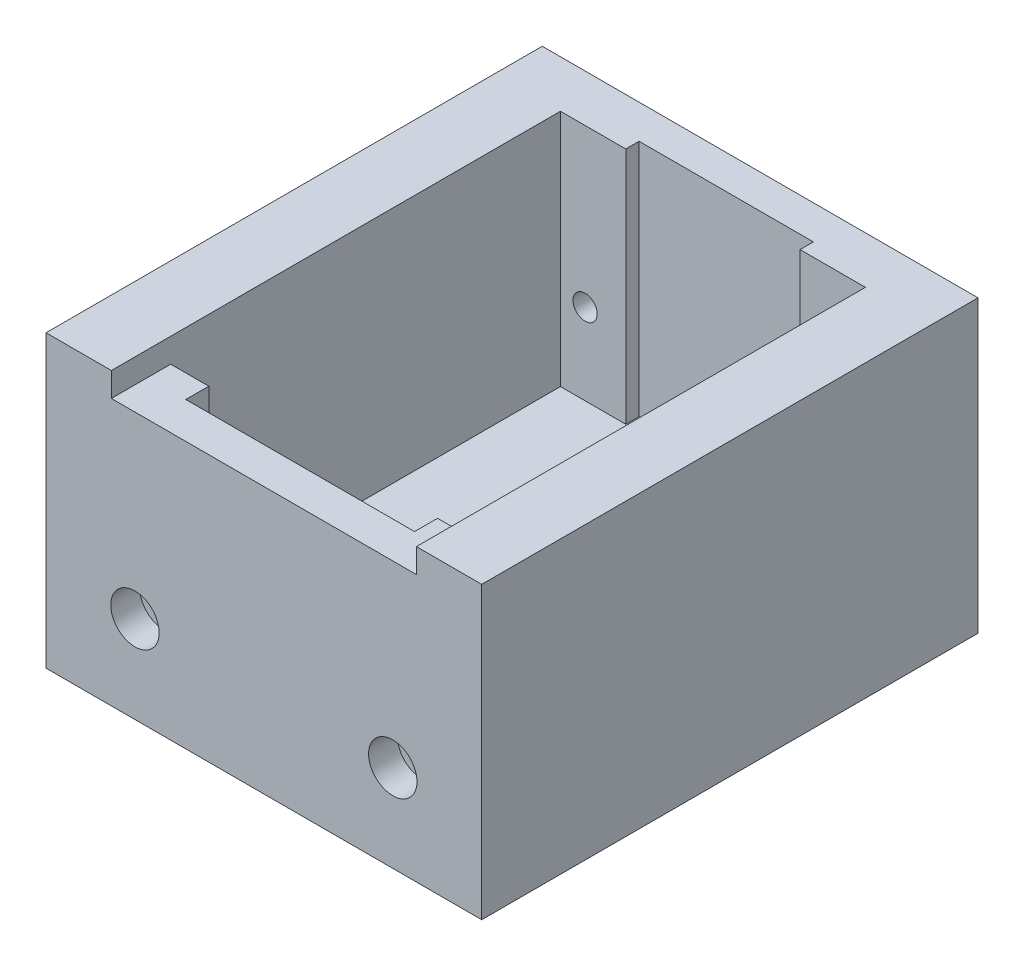
ISO-10303-21;
HEADER;
FILE_DESCRIPTION(('STEP AP214'),'2;1');
FILE_NAME('part.step','',(''),(''),'','','');
FILE_SCHEMA(('AUTOMOTIVE_DESIGN { 1 0 10303 214 1 1 1 1 }'));
ENDSEC;
DATA;
#1=APPLICATION_CONTEXT('core data for automotive mechanical design processes');
#2=APPLICATION_PROTOCOL_DEFINITION('international standard','automotive_design',2000,#1);
#3=PRODUCT_CONTEXT('',#1,'mechanical');
#4=PRODUCT('Part','Part','',(#3));
#5=PRODUCT_RELATED_PRODUCT_CATEGORY('part','',(#4));
#6=PRODUCT_DEFINITION_FORMATION('','',#4);
#7=PRODUCT_DEFINITION_CONTEXT('part definition',#1,'design');
#8=PRODUCT_DEFINITION('design','',#6,#7);
#9=PRODUCT_DEFINITION_SHAPE('','',#8);
#10=(LENGTH_UNIT() NAMED_UNIT(*) SI_UNIT(.MILLI.,.METRE.));
#11=(NAMED_UNIT(*) PLANE_ANGLE_UNIT() SI_UNIT($,.RADIAN.));
#12=(NAMED_UNIT(*) SI_UNIT($,.STERADIAN.) SOLID_ANGLE_UNIT());
#13=UNCERTAINTY_MEASURE_WITH_UNIT(LENGTH_MEASURE(1.E-05),#10,'distance_accuracy_value','');
#14=(GEOMETRIC_REPRESENTATION_CONTEXT(3) GLOBAL_UNCERTAINTY_ASSIGNED_CONTEXT((#13)) GLOBAL_UNIT_ASSIGNED_CONTEXT((#10,
#11,#12)) REPRESENTATION_CONTEXT('',''));
#15=CARTESIAN_POINT('',(0.,0.,0.));
#16=DIRECTION('',(0.,0.,1.));
#17=DIRECTION('',(1.,0.,0.));
#18=AXIS2_PLACEMENT_3D('',#15,#16,#17);
#19=CARTESIAN_POINT('',(0.,24.,0.));
#20=DIRECTION('',(0.,-1.,0.));
#21=DIRECTION('',(0.,0.,-1.));
#22=AXIS2_PLACEMENT_3D('',#19,#20,#21);
#23=PLANE('',#22);
#24=DIRECTION('',(0.,0.,-1.));
#25=VECTOR('',#24,1.);
#26=CARTESIAN_POINT('',(12.6,24.,16.1));
#27=LINE('',#26,#25);
#28=CARTESIAN_POINT('',(12.6,24.,21.));
#29=VERTEX_POINT('',#28);
#30=CARTESIAN_POINT('',(12.6,24.,-16.1));
#31=VERTEX_POINT('',#30);
#32=EDGE_CURVE('E236',#29,#31,#27,.T.);
#33=ORIENTED_EDGE('',*,*,#32,.F.);
#34=DIRECTION('',(-1.,0.,0.));
#35=VECTOR('',#34,1.);
#36=CARTESIAN_POINT('',(0.,24.,21.));
#37=LINE('',#36,#35);
#38=CARTESIAN_POINT('',(18.,24.,21.));
#39=VERTEX_POINT('',#38);
#40=EDGE_CURVE('E293',#39,#29,#37,.T.);
#41=ORIENTED_EDGE('',*,*,#40,.F.);
#42=DIRECTION('',(0.,0.,-1.));
#43=VECTOR('',#42,1.);
#44=CARTESIAN_POINT('',(18.,24.,25.));
#45=LINE('',#44,#43);
#46=CARTESIAN_POINT('',(18.,24.,-20.));
#47=VERTEX_POINT('',#46);
#48=EDGE_CURVE('E327',#39,#47,#45,.T.);
#49=ORIENTED_EDGE('',*,*,#48,.T.);
#50=DIRECTION('',(1.,0.,0.));
#51=VECTOR('',#50,1.);
#52=CARTESIAN_POINT('',(0.,24.,-20.));
#53=LINE('',#52,#51);
#54=CARTESIAN_POINT('',(-18.,24.,-20.));
#55=VERTEX_POINT('',#54);
#56=EDGE_CURVE('E287',#55,#47,#53,.T.);
#57=ORIENTED_EDGE('',*,*,#56,.F.);
#58=DIRECTION('',(0.,0.,1.));
#59=VECTOR('',#58,1.);
#60=CARTESIAN_POINT('',(-18.,24.,25.));
#61=LINE('',#60,#59);
#62=CARTESIAN_POINT('',(-18.,24.,21.));
#63=VERTEX_POINT('',#62);
#64=EDGE_CURVE('E330',#55,#63,#61,.T.);
#65=ORIENTED_EDGE('',*,*,#64,.T.);
#66=CARTESIAN_POINT('',(-12.6,24.,21.));
#67=VERTEX_POINT('',#66);
#68=EDGE_CURVE('E172',#67,#63,#37,.T.);
#69=ORIENTED_EDGE('',*,*,#68,.F.);
#70=DIRECTION('',(0.,0.,1.));
#71=VECTOR('',#70,1.);
#72=CARTESIAN_POINT('',(-12.6,24.,-16.1));
#73=LINE('',#72,#71);
#74=CARTESIAN_POINT('',(-12.6,24.,-16.1));
#75=VERTEX_POINT('',#74);
#76=EDGE_CURVE('E180',#75,#67,#73,.T.);
#77=ORIENTED_EDGE('',*,*,#76,.F.);
#78=DIRECTION('',(-1.,0.,0.));
#79=VECTOR('',#78,1.);
#80=CARTESIAN_POINT('',(-7.2,24.,-16.1));
#81=LINE('',#80,#79);
#82=CARTESIAN_POINT('',(-7.2,24.,-16.1));
#83=VERTEX_POINT('',#82);
#84=EDGE_CURVE('E213',#83,#75,#81,.T.);
#85=ORIENTED_EDGE('',*,*,#84,.F.);
#86=DIRECTION('',(0.,0.,1.));
#87=VECTOR('',#86,1.);
#88=CARTESIAN_POINT('',(-7.2,24.,-17.2));
#89=LINE('',#88,#87);
#90=CARTESIAN_POINT('',(-7.2,24.,-17.2));
#91=VERTEX_POINT('',#90);
#92=EDGE_CURVE('E248',#91,#83,#89,.T.);
#93=ORIENTED_EDGE('',*,*,#92,.F.);
#94=DIRECTION('',(-1.,0.,0.));
#95=VECTOR('',#94,1.);
#96=CARTESIAN_POINT('',(7.2,24.,-17.2));
#97=LINE('',#96,#95);
#98=CARTESIAN_POINT('',(7.2,24.,-17.2));
#99=VERTEX_POINT('',#98);
#100=EDGE_CURVE('E245',#99,#91,#97,.T.);
#101=ORIENTED_EDGE('',*,*,#100,.F.);
#102=DIRECTION('',(0.,0.,-1.));
#103=VECTOR('',#102,1.);
#104=CARTESIAN_POINT('',(7.2,24.,-16.1));
#105=LINE('',#104,#103);
#106=CARTESIAN_POINT('',(7.2,24.,-16.1));
#107=VERTEX_POINT('',#106);
#108=EDGE_CURVE('E242',#107,#99,#105,.T.);
#109=ORIENTED_EDGE('',*,*,#108,.F.);
#110=DIRECTION('',(-1.,0.,0.));
#111=VECTOR('',#110,1.);
#112=CARTESIAN_POINT('',(12.6,24.,-16.1));
#113=LINE('',#112,#111);
#114=EDGE_CURVE('E239',#31,#107,#113,.T.);
#115=ORIENTED_EDGE('',*,*,#114,.F.);
#116=EDGE_LOOP('',(#33,#41,#49,#57,#65,#69,#77,#85,#93,#101,#109,#115));
#117=FACE_BOUND('',#116,.T.);
#118=ADVANCED_FACE('F34',(#117),#23,.F.);
#119=CARTESIAN_POINT('',(18.,24.,25.));
#120=DIRECTION('',(-1.,0.,0.));
#121=DIRECTION('',(0.,0.,1.));
#122=AXIS2_PLACEMENT_3D('',#119,#120,#121);
#123=PLANE('',#122);
#124=DIRECTION('',(0.,-1.,0.));
#125=VECTOR('',#124,1.);
#126=CARTESIAN_POINT('',(18.,24.,-20.));
#127=LINE('',#126,#125);
#128=CARTESIAN_POINT('',(18.,0.,-20.));
#129=VERTEX_POINT('',#128);
#130=EDGE_CURVE('E57',#47,#129,#127,.T.);
#131=ORIENTED_EDGE('',*,*,#130,.F.);
#132=ORIENTED_EDGE('',*,*,#48,.F.);
#133=DIRECTION('',(0.,1.,0.));
#134=VECTOR('',#133,1.);
#135=CARTESIAN_POINT('',(18.,24.,21.));
#136=LINE('',#135,#134);
#137=CARTESIAN_POINT('',(18.,0.,21.));
#138=VERTEX_POINT('',#137);
#139=EDGE_CURVE('E297',#138,#39,#136,.T.);
#140=ORIENTED_EDGE('',*,*,#139,.F.);
#141=DIRECTION('',(0.,0.,-1.));
#142=VECTOR('',#141,1.);
#143=CARTESIAN_POINT('',(18.,0.,25.));
#144=LINE('',#143,#142);
#145=EDGE_CURVE('E324',#138,#129,#144,.T.);
#146=ORIENTED_EDGE('',*,*,#145,.T.);
#147=EDGE_LOOP('',(#131,#132,#140,#146));
#148=FACE_BOUND('',#147,.T.);
#149=ADVANCED_FACE('F36',(#148),#123,.F.);
#150=CARTESIAN_POINT('',(-18.,24.,25.));
#151=DIRECTION('',(1.,0.,0.));
#152=DIRECTION('',(0.,0.,-1.));
#153=AXIS2_PLACEMENT_3D('',#150,#151,#152);
#154=PLANE('',#153);
#155=DIRECTION('',(0.,1.,0.));
#156=VECTOR('',#155,1.);
#157=CARTESIAN_POINT('',(-18.,24.,-20.));
#158=LINE('',#157,#156);
#159=CARTESIAN_POINT('',(-18.,0.,-20.));
#160=VERTEX_POINT('',#159);
#161=EDGE_CURVE('E284',#160,#55,#158,.T.);
#162=ORIENTED_EDGE('',*,*,#161,.F.);
#163=DIRECTION('',(0.,0.,1.));
#164=VECTOR('',#163,1.);
#165=CARTESIAN_POINT('',(-18.,0.,25.));
#166=LINE('',#165,#164);
#167=CARTESIAN_POINT('',(-18.,0.,21.));
#168=VERTEX_POINT('',#167);
#169=EDGE_CURVE('E331',#160,#168,#166,.T.);
#170=ORIENTED_EDGE('',*,*,#169,.T.);
#171=DIRECTION('',(0.,-1.,0.));
#172=VECTOR('',#171,1.);
#173=CARTESIAN_POINT('',(-18.,24.,21.));
#174=LINE('',#173,#172);
#175=EDGE_CURVE('E294',#63,#168,#174,.T.);
#176=ORIENTED_EDGE('',*,*,#175,.F.);
#177=ORIENTED_EDGE('',*,*,#64,.F.);
#178=EDGE_LOOP('',(#162,#170,#176,#177));
#179=FACE_BOUND('',#178,.T.);
#180=ADVANCED_FACE('F421',(#179),#154,.F.);
#181=CARTESIAN_POINT('',(0.,0.,0.));
#182=DIRECTION('',(0.,-1.,0.));
#183=DIRECTION('',(0.,0.,-1.));
#184=AXIS2_PLACEMENT_3D('',#181,#182,#183);
#185=PLANE('',#184);
#186=ORIENTED_EDGE('',*,*,#169,.F.);
#187=DIRECTION('',(1.,0.,0.));
#188=VECTOR('',#187,1.);
#189=CARTESIAN_POINT('',(0.,0.,-20.));
#190=LINE('',#189,#188);
#191=EDGE_CURVE('E281',#160,#129,#190,.T.);
#192=ORIENTED_EDGE('',*,*,#191,.T.);
#193=ORIENTED_EDGE('',*,*,#145,.F.);
#194=DIRECTION('',(-1.,0.,0.));
#195=VECTOR('',#194,1.);
#196=CARTESIAN_POINT('',(0.,0.,21.));
#197=LINE('',#196,#195);
#198=EDGE_CURVE('E299',#138,#168,#197,.T.);
#199=ORIENTED_EDGE('',*,*,#198,.T.);
#200=EDGE_LOOP('',(#186,#192,#193,#199));
#201=FACE_BOUND('',#200,.T.);
#202=ADVANCED_FACE('F387',(#201),#185,.T.);
#203=CARTESIAN_POINT('',(-10.56,11.,-17.6));
#204=DIRECTION('',(0.,0.,-1.));
#205=DIRECTION('',(-1.,0.,0.));
#206=AXIS2_PLACEMENT_3D('',#203,#204,#205);
#207=CYLINDRICAL_SURFACE('',#206,2.);
#208=CARTESIAN_POINT('',(-10.56,11.,-17.6));
#209=DIRECTION('',(0.,0.,-1.));
#210=DIRECTION('',(-1.,0.,0.));
#211=AXIS2_PLACEMENT_3D('',#208,#209,#210);
#212=CIRCLE('',#211,2.);
#213=CARTESIAN_POINT('',(-12.56,11.,-17.6));
#214=VERTEX_POINT('',#213);
#215=EDGE_CURVE('E306',#214,#214,#212,.T.);
#216=ORIENTED_EDGE('',*,*,#215,.F.);
#217=EDGE_LOOP('',(#216));
#218=FACE_BOUND('',#217,.T.);
#219=CARTESIAN_POINT('',(-10.56,11.,-20.));
#220=DIRECTION('',(0.,0.,-1.));
#221=DIRECTION('',(-1.,0.,0.));
#222=AXIS2_PLACEMENT_3D('',#219,#220,#221);
#223=CIRCLE('',#222,2.);
#224=CARTESIAN_POINT('',(-12.56,11.,-20.));
#225=VERTEX_POINT('',#224);
#226=EDGE_CURVE('E278',#225,#225,#223,.F.);
#227=ORIENTED_EDGE('',*,*,#226,.F.);
#228=EDGE_LOOP('',(#227));
#229=FACE_BOUND('',#228,.T.);
#230=ADVANCED_FACE('F426',(#218,#229),#207,.F.);
#231=CARTESIAN_POINT('',(10.565,11.,-17.6));
#232=DIRECTION('',(0.,0.,-1.));
#233=DIRECTION('',(-1.,0.,0.));
#234=AXIS2_PLACEMENT_3D('',#231,#232,#233);
#235=CYLINDRICAL_SURFACE('',#234,2.);
#236=CARTESIAN_POINT('',(10.565,11.,-17.6));
#237=DIRECTION('',(0.,0.,-1.));
#238=DIRECTION('',(-1.,0.,0.));
#239=AXIS2_PLACEMENT_3D('',#236,#237,#238);
#240=CIRCLE('',#239,2.);
#241=CARTESIAN_POINT('',(8.56500000000001,11.,-17.6));
#242=VERTEX_POINT('',#241);
#243=EDGE_CURVE('E309',#242,#242,#240,.T.);
#244=ORIENTED_EDGE('',*,*,#243,.F.);
#245=EDGE_LOOP('',(#244));
#246=FACE_BOUND('',#245,.T.);
#247=CARTESIAN_POINT('',(10.565,11.,-20.));
#248=DIRECTION('',(0.,0.,-1.));
#249=DIRECTION('',(-1.,0.,0.));
#250=AXIS2_PLACEMENT_3D('',#247,#248,#249);
#251=CIRCLE('',#250,2.);
#252=CARTESIAN_POINT('',(8.56500000000001,11.,-20.));
#253=VERTEX_POINT('',#252);
#254=EDGE_CURVE('E282',#253,#253,#251,.F.);
#255=ORIENTED_EDGE('',*,*,#254,.F.);
#256=EDGE_LOOP('',(#255));
#257=FACE_BOUND('',#256,.T.);
#258=ADVANCED_FACE('F457',(#246,#257),#235,.F.);
#259=CARTESIAN_POINT('',(0.,22.,0.));
#260=DIRECTION('',(0.,-1.,0.));
#261=DIRECTION('',(0.,0.,-1.));
#262=AXIS2_PLACEMENT_3D('',#259,#260,#261);
#263=PLANE('',#262);
#264=DIRECTION('',(1.,0.,0.));
#265=VECTOR('',#264,1.);
#266=CARTESIAN_POINT('',(-9.44999999999999,22.,18.));
#267=LINE('',#266,#265);
#268=CARTESIAN_POINT('',(-9.44999999999999,22.,18.));
#269=VERTEX_POINT('',#268);
#270=CARTESIAN_POINT('',(9.45000000000001,22.,18.));
#271=VERTEX_POINT('',#270);
#272=EDGE_CURVE('E189',#269,#271,#267,.T.);
#273=ORIENTED_EDGE('',*,*,#272,.F.);
#274=DIRECTION('',(0.,0.,1.));
#275=VECTOR('',#274,1.);
#276=CARTESIAN_POINT('',(-9.44999999999999,22.,15.9));
#277=LINE('',#276,#275);
#278=CARTESIAN_POINT('',(-9.44999999999999,22.,16.1));
#279=VERTEX_POINT('',#278);
#280=EDGE_CURVE('E194',#279,#269,#277,.T.);
#281=ORIENTED_EDGE('',*,*,#280,.F.);
#282=DIRECTION('',(-1.,0.,0.));
#283=VECTOR('',#282,1.);
#284=CARTESIAN_POINT('',(0.,22.,16.1));
#285=LINE('',#284,#283);
#286=CARTESIAN_POINT('',(-12.6,22.,16.1));
#287=VERTEX_POINT('',#286);
#288=EDGE_CURVE('E49',#279,#287,#285,.T.);
#289=ORIENTED_EDGE('',*,*,#288,.T.);
#290=DIRECTION('',(0.,0.,1.));
#291=VECTOR('',#290,1.);
#292=CARTESIAN_POINT('',(-12.6,22.,-16.1));
#293=LINE('',#292,#291);
#294=CARTESIAN_POINT('',(-12.6,22.,21.));
#295=VERTEX_POINT('',#294);
#296=EDGE_CURVE('E177',#287,#295,#293,.T.);
#297=ORIENTED_EDGE('',*,*,#296,.T.);
#298=DIRECTION('',(-1.,0.,0.));
#299=VECTOR('',#298,1.);
#300=CARTESIAN_POINT('',(0.,22.,21.));
#301=LINE('',#300,#299);
#302=CARTESIAN_POINT('',(12.6,22.,21.));
#303=VERTEX_POINT('',#302);
#304=EDGE_CURVE('E161',#303,#295,#301,.T.);
#305=ORIENTED_EDGE('',*,*,#304,.F.);
#306=DIRECTION('',(0.,0.,-1.));
#307=VECTOR('',#306,1.);
#308=CARTESIAN_POINT('',(12.6,22.,-16.1));
#309=LINE('',#308,#307);
#310=CARTESIAN_POINT('',(12.6,22.,16.1));
#311=VERTEX_POINT('',#310);
#312=EDGE_CURVE('E184',#303,#311,#309,.T.);
#313=ORIENTED_EDGE('',*,*,#312,.T.);
#314=CARTESIAN_POINT('',(9.45000000000001,22.,16.1));
#315=VERTEX_POINT('',#314);
#316=EDGE_CURVE('E277',#311,#315,#285,.T.);
#317=ORIENTED_EDGE('',*,*,#316,.T.);
#318=DIRECTION('',(0.,0.,-1.));
#319=VECTOR('',#318,1.);
#320=CARTESIAN_POINT('',(9.45000000000001,22.,18.));
#321=LINE('',#320,#319);
#322=EDGE_CURVE('E202',#271,#315,#321,.T.);
#323=ORIENTED_EDGE('',*,*,#322,.F.);
#324=EDGE_LOOP('',(#273,#281,#289,#297,#305,#313,#317,#323));
#325=FACE_BOUND('',#324,.T.);
#326=ADVANCED_FACE('F183',(#325),#263,.F.);
#327=CARTESIAN_POINT('',(-10.65,7.2,18.6));
#328=DIRECTION('',(0.,0.,1.));
#329=DIRECTION('',(1.,0.,0.));
#330=AXIS2_PLACEMENT_3D('',#327,#328,#329);
#331=CYLINDRICAL_SURFACE('',#330,2.);
#332=CARTESIAN_POINT('',(-10.65,7.2,18.6));
#333=DIRECTION('',(0.,0.,1.));
#334=DIRECTION('',(1.,0.,0.));
#335=AXIS2_PLACEMENT_3D('',#332,#333,#334);
#336=CIRCLE('',#335,2.);
#337=CARTESIAN_POINT('',(-8.65,7.2,18.6));
#338=VERTEX_POINT('',#337);
#339=EDGE_CURVE('E318',#338,#338,#336,.T.);
#340=ORIENTED_EDGE('',*,*,#339,.F.);
#341=EDGE_LOOP('',(#340));
#342=FACE_BOUND('',#341,.T.);
#343=CARTESIAN_POINT('',(-10.65,7.2,21.));
#344=DIRECTION('',(0.,0.,1.));
#345=DIRECTION('',(1.,0.,0.));
#346=AXIS2_PLACEMENT_3D('',#343,#344,#345);
#347=CIRCLE('',#346,2.);
#348=CARTESIAN_POINT('',(-8.65,7.2,21.));
#349=VERTEX_POINT('',#348);
#350=EDGE_CURVE('E173',#349,#349,#347,.F.);
#351=ORIENTED_EDGE('',*,*,#350,.F.);
#352=EDGE_LOOP('',(#351));
#353=FACE_BOUND('',#352,.T.);
#354=ADVANCED_FACE('F483',(#342,#353),#331,.F.);
#355=CARTESIAN_POINT('',(10.65,7.2,18.6));
#356=DIRECTION('',(0.,0.,1.));
#357=DIRECTION('',(1.,0.,0.));
#358=AXIS2_PLACEMENT_3D('',#355,#356,#357);
#359=CYLINDRICAL_SURFACE('',#358,2.);
#360=CARTESIAN_POINT('',(10.65,7.2,18.6));
#361=DIRECTION('',(0.,0.,1.));
#362=DIRECTION('',(1.,0.,0.));
#363=AXIS2_PLACEMENT_3D('',#360,#361,#362);
#364=CIRCLE('',#363,2.);
#365=CARTESIAN_POINT('',(12.65,7.2,18.6));
#366=VERTEX_POINT('',#365);
#367=EDGE_CURVE('E321',#366,#366,#364,.T.);
#368=ORIENTED_EDGE('',*,*,#367,.F.);
#369=EDGE_LOOP('',(#368));
#370=FACE_BOUND('',#369,.T.);
#371=CARTESIAN_POINT('',(10.65,7.2,21.));
#372=DIRECTION('',(0.,0.,1.));
#373=DIRECTION('',(1.,0.,0.));
#374=AXIS2_PLACEMENT_3D('',#371,#372,#373);
#375=CIRCLE('',#374,2.);
#376=CARTESIAN_POINT('',(12.65,7.2,21.));
#377=VERTEX_POINT('',#376);
#378=EDGE_CURVE('E289',#377,#377,#375,.F.);
#379=ORIENTED_EDGE('',*,*,#378,.F.);
#380=EDGE_LOOP('',(#379));
#381=FACE_BOUND('',#380,.T.);
#382=ADVANCED_FACE('F480',(#370,#381),#359,.F.);
#383=CARTESIAN_POINT('',(0.,9.3,0.));
#384=DIRECTION('',(0.,-1.,0.));
#385=DIRECTION('',(0.,0.,-1.));
#386=AXIS2_PLACEMENT_3D('',#383,#384,#385);
#387=PLANE('',#386);
#388=DIRECTION('',(0.,0.,-1.));
#389=VECTOR('',#388,1.);
#390=CARTESIAN_POINT('',(9.45000000000001,9.3,18.));
#391=LINE('',#390,#389);
#392=CARTESIAN_POINT('',(9.45000000000001,9.3,18.));
#393=VERTEX_POINT('',#392);
#394=CARTESIAN_POINT('',(9.45000000000001,9.3,16.1));
#395=VERTEX_POINT('',#394);
#396=EDGE_CURVE('E193',#393,#395,#391,.T.);
#397=ORIENTED_EDGE('',*,*,#396,.T.);
#398=DIRECTION('',(-1.,0.,0.));
#399=VECTOR('',#398,1.);
#400=CARTESIAN_POINT('',(0.,9.3,16.1));
#401=LINE('',#400,#399);
#402=CARTESIAN_POINT('',(-9.44999999999999,9.3,16.1));
#403=VERTEX_POINT('',#402);
#404=EDGE_CURVE('E273',#395,#403,#401,.T.);
#405=ORIENTED_EDGE('',*,*,#404,.T.);
#406=DIRECTION('',(0.,0.,1.));
#407=VECTOR('',#406,1.);
#408=CARTESIAN_POINT('',(-9.44999999999999,9.3,15.9));
#409=LINE('',#408,#407);
#410=CARTESIAN_POINT('',(-9.44999999999999,9.3,18.));
#411=VERTEX_POINT('',#410);
#412=EDGE_CURVE('E197',#403,#411,#409,.T.);
#413=ORIENTED_EDGE('',*,*,#412,.T.);
#414=DIRECTION('',(1.,0.,0.));
#415=VECTOR('',#414,1.);
#416=CARTESIAN_POINT('',(-9.44999999999999,9.3,18.));
#417=LINE('',#416,#415);
#418=EDGE_CURVE('E190',#411,#393,#417,.T.);
#419=ORIENTED_EDGE('',*,*,#418,.T.);
#420=EDGE_LOOP('',(#397,#405,#413,#419));
#421=FACE_BOUND('',#420,.T.);
#422=ADVANCED_FACE('F362',(#421),#387,.F.);
#423=CARTESIAN_POINT('',(-10.65,7.2,18.6));
#424=DIRECTION('',(0.,0.,1.));
#425=DIRECTION('',(1.,0.,0.));
#426=AXIS2_PLACEMENT_3D('',#423,#424,#425);
#427=PLANE('',#426);
#428=CARTESIAN_POINT('',(-10.65,7.2,18.6));
#429=DIRECTION('',(0.,0.,1.));
#430=DIRECTION('',(1.,0.,0.));
#431=AXIS2_PLACEMENT_3D('',#428,#429,#430);
#432=CIRCLE('',#431,1.);
#433=CARTESIAN_POINT('',(-9.65,7.2,18.6));
#434=VERTEX_POINT('',#433);
#435=EDGE_CURVE('E312',#434,#434,#432,.T.);
#436=ORIENTED_EDGE('',*,*,#435,.F.);
#437=EDGE_LOOP('',(#436));
#438=FACE_BOUND('',#437,.T.);
#439=ORIENTED_EDGE('',*,*,#339,.T.);
#440=EDGE_LOOP('',(#439));
#441=FACE_BOUND('',#440,.T.);
#442=ADVANCED_FACE('F478',(#438,#441),#427,.T.);
#443=CARTESIAN_POINT('',(10.65,7.2,18.6));
#444=DIRECTION('',(0.,0.,1.));
#445=DIRECTION('',(1.,0.,0.));
#446=AXIS2_PLACEMENT_3D('',#443,#444,#445);
#447=PLANE('',#446);
#448=CARTESIAN_POINT('',(10.65,7.2,18.6));
#449=DIRECTION('',(0.,0.,1.));
#450=DIRECTION('',(1.,0.,0.));
#451=AXIS2_PLACEMENT_3D('',#448,#449,#450);
#452=CIRCLE('',#451,1.);
#453=CARTESIAN_POINT('',(11.65,7.2,18.6));
#454=VERTEX_POINT('',#453);
#455=EDGE_CURVE('E315',#454,#454,#452,.T.);
#456=ORIENTED_EDGE('',*,*,#455,.F.);
#457=EDGE_LOOP('',(#456));
#458=FACE_BOUND('',#457,.T.);
#459=ORIENTED_EDGE('',*,*,#367,.T.);
#460=EDGE_LOOP('',(#459));
#461=FACE_BOUND('',#460,.T.);
#462=ADVANCED_FACE('F474',(#458,#461),#447,.T.);
#463=CARTESIAN_POINT('',(-10.65,7.2,12.2));
#464=DIRECTION('',(0.,0.,1.));
#465=DIRECTION('',(1.,0.,0.));
#466=AXIS2_PLACEMENT_3D('',#463,#464,#465);
#467=CYLINDRICAL_SURFACE('',#466,1.);
#468=CARTESIAN_POINT('',(-10.65,7.2,16.1));
#469=DIRECTION('',(0.,0.,1.));
#470=DIRECTION('',(1.,0.,0.));
#471=AXIS2_PLACEMENT_3D('',#468,#469,#470);
#472=CIRCLE('',#471,1.);
#473=CARTESIAN_POINT('',(-9.65,7.2,16.1));
#474=VERTEX_POINT('',#473);
#475=EDGE_CURVE('E270',#474,#474,#472,.F.);
#476=ORIENTED_EDGE('',*,*,#475,.T.);
#477=EDGE_LOOP('',(#476));
#478=FACE_BOUND('',#477,.T.);
#479=ORIENTED_EDGE('',*,*,#435,.T.);
#480=EDGE_LOOP('',(#479));
#481=FACE_BOUND('',#480,.T.);
#482=ADVANCED_FACE('F470',(#478,#481),#467,.F.);
#483=CARTESIAN_POINT('',(10.65,7.2,12.2));
#484=DIRECTION('',(0.,0.,1.));
#485=DIRECTION('',(1.,0.,0.));
#486=AXIS2_PLACEMENT_3D('',#483,#484,#485);
#487=CYLINDRICAL_SURFACE('',#486,1.);
#488=CARTESIAN_POINT('',(10.65,7.2,16.1));
#489=DIRECTION('',(0.,0.,1.));
#490=DIRECTION('',(1.,0.,0.));
#491=AXIS2_PLACEMENT_3D('',#488,#489,#490);
#492=CIRCLE('',#491,1.);
#493=CARTESIAN_POINT('',(11.65,7.2,16.1));
#494=VERTEX_POINT('',#493);
#495=EDGE_CURVE('E274',#494,#494,#492,.F.);
#496=ORIENTED_EDGE('',*,*,#495,.T.);
#497=EDGE_LOOP('',(#496));
#498=FACE_BOUND('',#497,.T.);
#499=ORIENTED_EDGE('',*,*,#455,.T.);
#500=EDGE_LOOP('',(#499));
#501=FACE_BOUND('',#500,.T.);
#502=ADVANCED_FACE('F463',(#498,#501),#487,.F.);
#503=CARTESIAN_POINT('',(-10.56,11.,-17.6));
#504=DIRECTION('',(0.,0.,-1.));
#505=DIRECTION('',(-1.,0.,0.));
#506=AXIS2_PLACEMENT_3D('',#503,#504,#505);
#507=PLANE('',#506);
#508=CARTESIAN_POINT('',(-10.56,11.,-17.6));
#509=DIRECTION('',(0.,0.,-1.));
#510=DIRECTION('',(-1.,0.,0.));
#511=AXIS2_PLACEMENT_3D('',#508,#509,#510);
#512=CIRCLE('',#511,1.);
#513=CARTESIAN_POINT('',(-11.56,11.,-17.6));
#514=VERTEX_POINT('',#513);
#515=EDGE_CURVE('E303',#514,#514,#512,.T.);
#516=ORIENTED_EDGE('',*,*,#515,.F.);
#517=EDGE_LOOP('',(#516));
#518=FACE_BOUND('',#517,.T.);
#519=ORIENTED_EDGE('',*,*,#215,.T.);
#520=EDGE_LOOP('',(#519));
#521=FACE_BOUND('',#520,.T.);
#522=ADVANCED_FACE('F455',(#518,#521),#507,.T.);
#523=CARTESIAN_POINT('',(10.565,11.,-17.6));
#524=DIRECTION('',(0.,0.,-1.));
#525=DIRECTION('',(-1.,0.,0.));
#526=AXIS2_PLACEMENT_3D('',#523,#524,#525);
#527=PLANE('',#526);
#528=CARTESIAN_POINT('',(10.565,11.,-17.6));
#529=DIRECTION('',(0.,0.,-1.));
#530=DIRECTION('',(-1.,0.,0.));
#531=AXIS2_PLACEMENT_3D('',#528,#529,#530);
#532=CIRCLE('',#531,1.);
#533=CARTESIAN_POINT('',(9.56500000000001,11.,-17.6));
#534=VERTEX_POINT('',#533);
#535=EDGE_CURVE('E302',#534,#534,#532,.T.);
#536=ORIENTED_EDGE('',*,*,#535,.F.);
#537=EDGE_LOOP('',(#536));
#538=FACE_BOUND('',#537,.T.);
#539=ORIENTED_EDGE('',*,*,#243,.T.);
#540=EDGE_LOOP('',(#539));
#541=FACE_BOUND('',#540,.T.);
#542=ADVANCED_FACE('F451',(#538,#541),#527,.T.);
#543=CARTESIAN_POINT('',(10.565,11.,-10.2));
#544=DIRECTION('',(0.,0.,-1.));
#545=DIRECTION('',(-1.,0.,0.));
#546=AXIS2_PLACEMENT_3D('',#543,#544,#545);
#547=CYLINDRICAL_SURFACE('',#546,1.);
#548=CARTESIAN_POINT('',(10.565,11.,-16.1));
#549=DIRECTION('',(0.,0.,-1.));
#550=DIRECTION('',(-1.,0.,0.));
#551=AXIS2_PLACEMENT_3D('',#548,#549,#550);
#552=CIRCLE('',#551,1.);
#553=CARTESIAN_POINT('',(9.56500000000001,11.,-16.1));
#554=VERTEX_POINT('',#553);
#555=EDGE_CURVE('E343',#554,#554,#552,.F.);
#556=ORIENTED_EDGE('',*,*,#555,.T.);
#557=EDGE_LOOP('',(#556));
#558=FACE_BOUND('',#557,.T.);
#559=ORIENTED_EDGE('',*,*,#535,.T.);
#560=EDGE_LOOP('',(#559));
#561=FACE_BOUND('',#560,.T.);
#562=ADVANCED_FACE('F447',(#558,#561),#547,.F.);
#563=CARTESIAN_POINT('',(-10.56,11.,-10.2));
#564=DIRECTION('',(0.,0.,-1.));
#565=DIRECTION('',(-1.,0.,0.));
#566=AXIS2_PLACEMENT_3D('',#563,#564,#565);
#567=CYLINDRICAL_SURFACE('',#566,1.);
#568=CARTESIAN_POINT('',(-10.56,11.,-16.1));
#569=DIRECTION('',(0.,0.,-1.));
#570=DIRECTION('',(-1.,0.,0.));
#571=AXIS2_PLACEMENT_3D('',#568,#569,#570);
#572=CIRCLE('',#571,1.);
#573=CARTESIAN_POINT('',(-11.56,11.,-16.1));
#574=VERTEX_POINT('',#573);
#575=EDGE_CURVE('E255',#574,#574,#572,.F.);
#576=ORIENTED_EDGE('',*,*,#575,.T.);
#577=EDGE_LOOP('',(#576));
#578=FACE_BOUND('',#577,.T.);
#579=ORIENTED_EDGE('',*,*,#515,.T.);
#580=EDGE_LOOP('',(#579));
#581=FACE_BOUND('',#580,.T.);
#582=ADVANCED_FACE('F441',(#578,#581),#567,.F.);
#583=CARTESIAN_POINT('',(0.,0.,21.));
#584=DIRECTION('',(0.,0.,1.));
#585=DIRECTION('',(1.,0.,0.));
#586=AXIS2_PLACEMENT_3D('',#583,#584,#585);
#587=PLANE('',#586);
#588=DIRECTION('',(0.,1.,0.));
#589=VECTOR('',#588,1.);
#590=CARTESIAN_POINT('',(12.6,0.,21.));
#591=LINE('',#590,#589);
#592=EDGE_CURVE('E169',#303,#29,#591,.T.);
#593=ORIENTED_EDGE('',*,*,#592,.F.);
#594=ORIENTED_EDGE('',*,*,#304,.T.);
#595=DIRECTION('',(0.,-1.,0.));
#596=VECTOR('',#595,1.);
#597=CARTESIAN_POINT('',(-12.6,0.,21.));
#598=LINE('',#597,#596);
#599=EDGE_CURVE('E165',#67,#295,#598,.T.);
#600=ORIENTED_EDGE('',*,*,#599,.F.);
#601=ORIENTED_EDGE('',*,*,#68,.T.);
#602=ORIENTED_EDGE('',*,*,#175,.T.);
#603=ORIENTED_EDGE('',*,*,#198,.F.);
#604=ORIENTED_EDGE('',*,*,#139,.T.);
#605=ORIENTED_EDGE('',*,*,#40,.T.);
#606=EDGE_LOOP('',(#593,#594,#600,#601,#602,#603,#604,#605));
#607=FACE_BOUND('',#606,.T.);
#608=ORIENTED_EDGE('',*,*,#378,.T.);
#609=EDGE_LOOP('',(#608));
#610=FACE_BOUND('',#609,.T.);
#611=ORIENTED_EDGE('',*,*,#350,.T.);
#612=EDGE_LOOP('',(#611));
#613=FACE_BOUND('',#612,.T.);
#614=ADVANCED_FACE('F163',(#607,#610,#613),#587,.T.);
#615=CARTESIAN_POINT('',(0.,0.,-20.));
#616=DIRECTION('',(0.,0.,-1.));
#617=DIRECTION('',(-1.,0.,0.));
#618=AXIS2_PLACEMENT_3D('',#615,#616,#617);
#619=PLANE('',#618);
#620=ORIENTED_EDGE('',*,*,#226,.T.);
#621=EDGE_LOOP('',(#620));
#622=FACE_BOUND('',#621,.T.);
#623=ORIENTED_EDGE('',*,*,#254,.T.);
#624=EDGE_LOOP('',(#623));
#625=FACE_BOUND('',#624,.T.);
#626=ORIENTED_EDGE('',*,*,#56,.T.);
#627=ORIENTED_EDGE('',*,*,#130,.T.);
#628=ORIENTED_EDGE('',*,*,#191,.F.);
#629=ORIENTED_EDGE('',*,*,#161,.T.);
#630=EDGE_LOOP('',(#626,#627,#628,#629));
#631=FACE_BOUND('',#630,.T.);
#632=ADVANCED_FACE('F431',(#622,#625,#631),#619,.T.);
#633=CARTESIAN_POINT('',(-12.6,4.3,16.1));
#634=DIRECTION('',(0.,0.,1.));
#635=DIRECTION('',(1.,0.,0.));
#636=AXIS2_PLACEMENT_3D('',#633,#634,#635);
#637=PLANE('',#636);
#638=ORIENTED_EDGE('',*,*,#495,.F.);
#639=EDGE_LOOP('',(#638));
#640=FACE_BOUND('',#639,.T.);
#641=ORIENTED_EDGE('',*,*,#475,.F.);
#642=EDGE_LOOP('',(#641));
#643=FACE_BOUND('',#642,.T.);
#644=DIRECTION('',(0.,1.,0.));
#645=VECTOR('',#644,1.);
#646=CARTESIAN_POINT('',(-12.6,4.3,16.1));
#647=LINE('',#646,#645);
#648=CARTESIAN_POINT('',(-12.6,4.3,16.1));
#649=VERTEX_POINT('',#648);
#650=EDGE_CURVE('E234',#649,#287,#647,.T.);
#651=ORIENTED_EDGE('',*,*,#650,.T.);
#652=ORIENTED_EDGE('',*,*,#288,.F.);
#653=DIRECTION('',(0.,-1.,0.));
#654=VECTOR('',#653,1.);
#655=CARTESIAN_POINT('',(-9.44999999999999,4.3,16.1));
#656=LINE('',#655,#654);
#657=EDGE_CURVE('E42',#279,#403,#656,.T.);
#658=ORIENTED_EDGE('',*,*,#657,.T.);
#659=ORIENTED_EDGE('',*,*,#404,.F.);
#660=DIRECTION('',(0.,1.,0.));
#661=VECTOR('',#660,1.);
#662=CARTESIAN_POINT('',(9.45000000000001,4.3,16.1));
#663=LINE('',#662,#661);
#664=EDGE_CURVE('E11',#395,#315,#663,.T.);
#665=ORIENTED_EDGE('',*,*,#664,.T.);
#666=ORIENTED_EDGE('',*,*,#316,.F.);
#667=DIRECTION('',(0.,1.,0.));
#668=VECTOR('',#667,1.);
#669=CARTESIAN_POINT('',(12.6,4.3,16.1));
#670=LINE('',#669,#668);
#671=CARTESIAN_POINT('',(12.6,4.3,16.1));
#672=VERTEX_POINT('',#671);
#673=EDGE_CURVE('E266',#672,#311,#670,.T.);
#674=ORIENTED_EDGE('',*,*,#673,.F.);
#675=DIRECTION('',(1.,0.,0.));
#676=VECTOR('',#675,1.);
#677=CARTESIAN_POINT('',(-12.6,4.3,16.1));
#678=LINE('',#677,#676);
#679=EDGE_CURVE('E212',#649,#672,#678,.T.);
#680=ORIENTED_EDGE('',*,*,#679,.F.);
#681=EDGE_LOOP('',(#651,#652,#658,#659,#665,#666,#674,#680));
#682=FACE_BOUND('',#681,.T.);
#683=ADVANCED_FACE('F349',(#640,#643,#682),#637,.F.);
#684=CARTESIAN_POINT('',(12.6,4.3,-16.1));
#685=DIRECTION('',(0.,0.,-1.));
#686=DIRECTION('',(-1.,0.,0.));
#687=AXIS2_PLACEMENT_3D('',#684,#685,#686);
#688=PLANE('',#687);
#689=DIRECTION('',(0.,1.,0.));
#690=VECTOR('',#689,1.);
#691=CARTESIAN_POINT('',(12.6,4.3,-16.1));
#692=LINE('',#691,#690);
#693=CARTESIAN_POINT('',(12.6,4.3,-16.1));
#694=VERTEX_POINT('',#693);
#695=EDGE_CURVE('E264',#694,#31,#692,.T.);
#696=ORIENTED_EDGE('',*,*,#695,.T.);
#697=ORIENTED_EDGE('',*,*,#114,.T.);
#698=DIRECTION('',(0.,1.,0.));
#699=VECTOR('',#698,1.);
#700=CARTESIAN_POINT('',(7.2,4.3,-16.1));
#701=LINE('',#700,#699);
#702=CARTESIAN_POINT('',(7.2,4.3,-16.1));
#703=VERTEX_POINT('',#702);
#704=EDGE_CURVE('E262',#703,#107,#701,.T.);
#705=ORIENTED_EDGE('',*,*,#704,.F.);
#706=DIRECTION('',(-1.,0.,0.));
#707=VECTOR('',#706,1.);
#708=CARTESIAN_POINT('',(12.6,4.3,-16.1));
#709=LINE('',#708,#707);
#710=EDGE_CURVE('E219',#694,#703,#709,.T.);
#711=ORIENTED_EDGE('',*,*,#710,.F.);
#712=EDGE_LOOP('',(#696,#697,#705,#711));
#713=FACE_BOUND('',#712,.T.);
#714=ORIENTED_EDGE('',*,*,#555,.F.);
#715=EDGE_LOOP('',(#714));
#716=FACE_BOUND('',#715,.T.);
#717=ADVANCED_FACE('F395',(#713,#716),#688,.F.);
#718=CARTESIAN_POINT('',(-7.2,4.3,-16.1));
#719=DIRECTION('',(0.,0.,-1.));
#720=DIRECTION('',(-1.,0.,0.));
#721=AXIS2_PLACEMENT_3D('',#718,#719,#720);
#722=PLANE('',#721);
#723=DIRECTION('',(0.,1.,0.));
#724=VECTOR('',#723,1.);
#725=CARTESIAN_POINT('',(-7.2,4.3,-16.1));
#726=LINE('',#725,#724);
#727=CARTESIAN_POINT('',(-7.2,4.3,-16.1));
#728=VERTEX_POINT('',#727);
#729=EDGE_CURVE('E256',#728,#83,#726,.T.);
#730=ORIENTED_EDGE('',*,*,#729,.T.);
#731=ORIENTED_EDGE('',*,*,#84,.T.);
#732=DIRECTION('',(0.,1.,0.));
#733=VECTOR('',#732,1.);
#734=CARTESIAN_POINT('',(-12.6,4.3,-16.1));
#735=LINE('',#734,#733);
#736=CARTESIAN_POINT('',(-12.6,4.3,-16.1));
#737=VERTEX_POINT('',#736);
#738=EDGE_CURVE('E253',#737,#75,#735,.T.);
#739=ORIENTED_EDGE('',*,*,#738,.F.);
#740=DIRECTION('',(-1.,0.,0.));
#741=VECTOR('',#740,1.);
#742=CARTESIAN_POINT('',(-7.2,4.3,-16.1));
#743=LINE('',#742,#741);
#744=EDGE_CURVE('E231',#728,#737,#743,.T.);
#745=ORIENTED_EDGE('',*,*,#744,.F.);
#746=EDGE_LOOP('',(#730,#731,#739,#745));
#747=FACE_BOUND('',#746,.T.);
#748=ORIENTED_EDGE('',*,*,#575,.F.);
#749=EDGE_LOOP('',(#748));
#750=FACE_BOUND('',#749,.T.);
#751=ADVANCED_FACE('F375',(#747,#750),#722,.F.);
#752=CARTESIAN_POINT('',(-12.6,4.3,-16.1));
#753=DIRECTION('',(-1.,0.,0.));
#754=DIRECTION('',(0.,0.,1.));
#755=AXIS2_PLACEMENT_3D('',#752,#753,#754);
#756=PLANE('',#755);
#757=ORIENTED_EDGE('',*,*,#738,.T.);
#758=ORIENTED_EDGE('',*,*,#76,.T.);
#759=ORIENTED_EDGE('',*,*,#599,.T.);
#760=ORIENTED_EDGE('',*,*,#296,.F.);
#761=ORIENTED_EDGE('',*,*,#650,.F.);
#762=DIRECTION('',(0.,0.,1.));
#763=VECTOR('',#762,1.);
#764=CARTESIAN_POINT('',(-12.6,4.3,-16.1));
#765=LINE('',#764,#763);
#766=EDGE_CURVE('E209',#737,#649,#765,.T.);
#767=ORIENTED_EDGE('',*,*,#766,.F.);
#768=EDGE_LOOP('',(#757,#758,#759,#760,#761,#767));
#769=FACE_BOUND('',#768,.T.);
#770=ADVANCED_FACE('F176',(#769),#756,.F.);
#771=CARTESIAN_POINT('',(-7.2,4.3,-17.2));
#772=DIRECTION('',(-1.,0.,0.));
#773=DIRECTION('',(0.,0.,1.));
#774=AXIS2_PLACEMENT_3D('',#771,#772,#773);
#775=PLANE('',#774);
#776=ORIENTED_EDGE('',*,*,#92,.T.);
#777=ORIENTED_EDGE('',*,*,#729,.F.);
#778=DIRECTION('',(0.,0.,1.));
#779=VECTOR('',#778,1.);
#780=CARTESIAN_POINT('',(-7.2,4.3,-17.2));
#781=LINE('',#780,#779);
#782=CARTESIAN_POINT('',(-7.2,4.3,-17.2));
#783=VERTEX_POINT('',#782);
#784=EDGE_CURVE('E228',#783,#728,#781,.T.);
#785=ORIENTED_EDGE('',*,*,#784,.F.);
#786=DIRECTION('',(0.,1.,0.));
#787=VECTOR('',#786,1.);
#788=CARTESIAN_POINT('',(-7.2,4.3,-17.2));
#789=LINE('',#788,#787);
#790=EDGE_CURVE('E258',#783,#91,#789,.T.);
#791=ORIENTED_EDGE('',*,*,#790,.T.);
#792=EDGE_LOOP('',(#776,#777,#785,#791));
#793=FACE_BOUND('',#792,.T.);
#794=ADVANCED_FACE('F406',(#793),#775,.F.);
#795=CARTESIAN_POINT('',(7.2,4.3,-17.2));
#796=DIRECTION('',(0.,0.,-1.));
#797=DIRECTION('',(-1.,0.,0.));
#798=AXIS2_PLACEMENT_3D('',#795,#796,#797);
#799=PLANE('',#798);
#800=ORIENTED_EDGE('',*,*,#100,.T.);
#801=ORIENTED_EDGE('',*,*,#790,.F.);
#802=DIRECTION('',(-1.,0.,0.));
#803=VECTOR('',#802,1.);
#804=CARTESIAN_POINT('',(7.2,4.3,-17.2));
#805=LINE('',#804,#803);
#806=CARTESIAN_POINT('',(7.2,4.3,-17.2));
#807=VERTEX_POINT('',#806);
#808=EDGE_CURVE('E225',#807,#783,#805,.T.);
#809=ORIENTED_EDGE('',*,*,#808,.F.);
#810=DIRECTION('',(0.,1.,0.));
#811=VECTOR('',#810,1.);
#812=CARTESIAN_POINT('',(7.2,4.3,-17.2));
#813=LINE('',#812,#811);
#814=EDGE_CURVE('E260',#807,#99,#813,.T.);
#815=ORIENTED_EDGE('',*,*,#814,.T.);
#816=EDGE_LOOP('',(#800,#801,#809,#815));
#817=FACE_BOUND('',#816,.T.);
#818=ADVANCED_FACE('F403',(#817),#799,.F.);
#819=CARTESIAN_POINT('',(7.2,4.3,-16.1));
#820=DIRECTION('',(1.,0.,0.));
#821=DIRECTION('',(0.,0.,-1.));
#822=AXIS2_PLACEMENT_3D('',#819,#820,#821);
#823=PLANE('',#822);
#824=ORIENTED_EDGE('',*,*,#108,.T.);
#825=ORIENTED_EDGE('',*,*,#814,.F.);
#826=DIRECTION('',(0.,0.,-1.));
#827=VECTOR('',#826,1.);
#828=CARTESIAN_POINT('',(7.2,4.3,-16.1));
#829=LINE('',#828,#827);
#830=EDGE_CURVE('E222',#703,#807,#829,.T.);
#831=ORIENTED_EDGE('',*,*,#830,.F.);
#832=ORIENTED_EDGE('',*,*,#704,.T.);
#833=EDGE_LOOP('',(#824,#825,#831,#832));
#834=FACE_BOUND('',#833,.T.);
#835=ADVANCED_FACE('F400',(#834),#823,.F.);
#836=CARTESIAN_POINT('',(12.6,4.3,16.1));
#837=DIRECTION('',(1.,0.,0.));
#838=DIRECTION('',(0.,0.,-1.));
#839=AXIS2_PLACEMENT_3D('',#836,#837,#838);
#840=PLANE('',#839);
#841=ORIENTED_EDGE('',*,*,#673,.T.);
#842=ORIENTED_EDGE('',*,*,#312,.F.);
#843=ORIENTED_EDGE('',*,*,#592,.T.);
#844=ORIENTED_EDGE('',*,*,#32,.T.);
#845=ORIENTED_EDGE('',*,*,#695,.F.);
#846=DIRECTION('',(0.,0.,-1.));
#847=VECTOR('',#846,1.);
#848=CARTESIAN_POINT('',(12.6,4.3,16.1));
#849=LINE('',#848,#847);
#850=EDGE_CURVE('E216',#672,#694,#849,.T.);
#851=ORIENTED_EDGE('',*,*,#850,.F.);
#852=EDGE_LOOP('',(#841,#842,#843,#844,#845,#851));
#853=FACE_BOUND('',#852,.T.);
#854=ADVANCED_FACE('F367',(#853),#840,.F.);
#855=CARTESIAN_POINT('',(0.,4.3,0.));
#856=DIRECTION('',(0.,-1.,0.));
#857=DIRECTION('',(0.,0.,-1.));
#858=AXIS2_PLACEMENT_3D('',#855,#856,#857);
#859=PLANE('',#858);
#860=ORIENTED_EDGE('',*,*,#766,.T.);
#861=ORIENTED_EDGE('',*,*,#679,.T.);
#862=ORIENTED_EDGE('',*,*,#850,.T.);
#863=ORIENTED_EDGE('',*,*,#710,.T.);
#864=ORIENTED_EDGE('',*,*,#830,.T.);
#865=ORIENTED_EDGE('',*,*,#808,.T.);
#866=ORIENTED_EDGE('',*,*,#784,.T.);
#867=ORIENTED_EDGE('',*,*,#744,.T.);
#868=EDGE_LOOP('',(#860,#861,#862,#863,#864,#865,#866,#867));
#869=FACE_BOUND('',#868,.T.);
#870=ADVANCED_FACE('F371',(#869),#859,.F.);
#871=CARTESIAN_POINT('',(-9.44999999999999,9.3,15.9));
#872=DIRECTION('',(-1.,0.,0.));
#873=DIRECTION('',(0.,0.,1.));
#874=AXIS2_PLACEMENT_3D('',#871,#872,#873);
#875=PLANE('',#874);
#876=ORIENTED_EDGE('',*,*,#280,.T.);
#877=DIRECTION('',(0.,1.,0.));
#878=VECTOR('',#877,1.);
#879=CARTESIAN_POINT('',(-9.44999999999999,9.3,18.));
#880=LINE('',#879,#878);
#881=EDGE_CURVE('E205',#411,#269,#880,.T.);
#882=ORIENTED_EDGE('',*,*,#881,.F.);
#883=ORIENTED_EDGE('',*,*,#412,.F.);
#884=ORIENTED_EDGE('',*,*,#657,.F.);
#885=EDGE_LOOP('',(#876,#882,#883,#884));
#886=FACE_BOUND('',#885,.T.);
#887=ADVANCED_FACE('F353',(#886),#875,.F.);
#888=CARTESIAN_POINT('',(9.45000000000001,9.3,18.));
#889=DIRECTION('',(1.,0.,0.));
#890=DIRECTION('',(0.,0.,-1.));
#891=AXIS2_PLACEMENT_3D('',#888,#889,#890);
#892=PLANE('',#891);
#893=ORIENTED_EDGE('',*,*,#396,.F.);
#894=DIRECTION('',(0.,1.,0.));
#895=VECTOR('',#894,1.);
#896=CARTESIAN_POINT('',(9.45000000000001,9.3,18.));
#897=LINE('',#896,#895);
#898=EDGE_CURVE('E199',#393,#271,#897,.T.);
#899=ORIENTED_EDGE('',*,*,#898,.T.);
#900=ORIENTED_EDGE('',*,*,#322,.T.);
#901=ORIENTED_EDGE('',*,*,#664,.F.);
#902=EDGE_LOOP('',(#893,#899,#900,#901));
#903=FACE_BOUND('',#902,.T.);
#904=ADVANCED_FACE('F364',(#903),#892,.F.);
#905=CARTESIAN_POINT('',(-9.44999999999999,9.3,18.));
#906=DIRECTION('',(0.,0.,1.));
#907=DIRECTION('',(1.,0.,0.));
#908=AXIS2_PLACEMENT_3D('',#905,#906,#907);
#909=PLANE('',#908);
#910=ORIENTED_EDGE('',*,*,#272,.T.);
#911=ORIENTED_EDGE('',*,*,#898,.F.);
#912=ORIENTED_EDGE('',*,*,#418,.F.);
#913=ORIENTED_EDGE('',*,*,#881,.T.);
#914=EDGE_LOOP('',(#910,#911,#912,#913));
#915=FACE_BOUND('',#914,.T.);
#916=ADVANCED_FACE('F358',(#915),#909,.F.);
#917=CLOSED_SHELL('',(#118,#149,#180,#202,#230,#258,#326,#354,#382,#422,#442,#462,#482,#502,
#522,#542,#562,#582,#614,#632,#683,#717,#751,#770,#794,#818,#835,#854,#870,#887,#904,#916));
#918=MANIFOLD_SOLID_BREP('B2',#917);
#919=ADVANCED_BREP_SHAPE_REPRESENTATION('',(#18,#918),#14);
#920=SHAPE_DEFINITION_REPRESENTATION(#9,#919);
ENDSEC;
END-ISO-10303-21;
